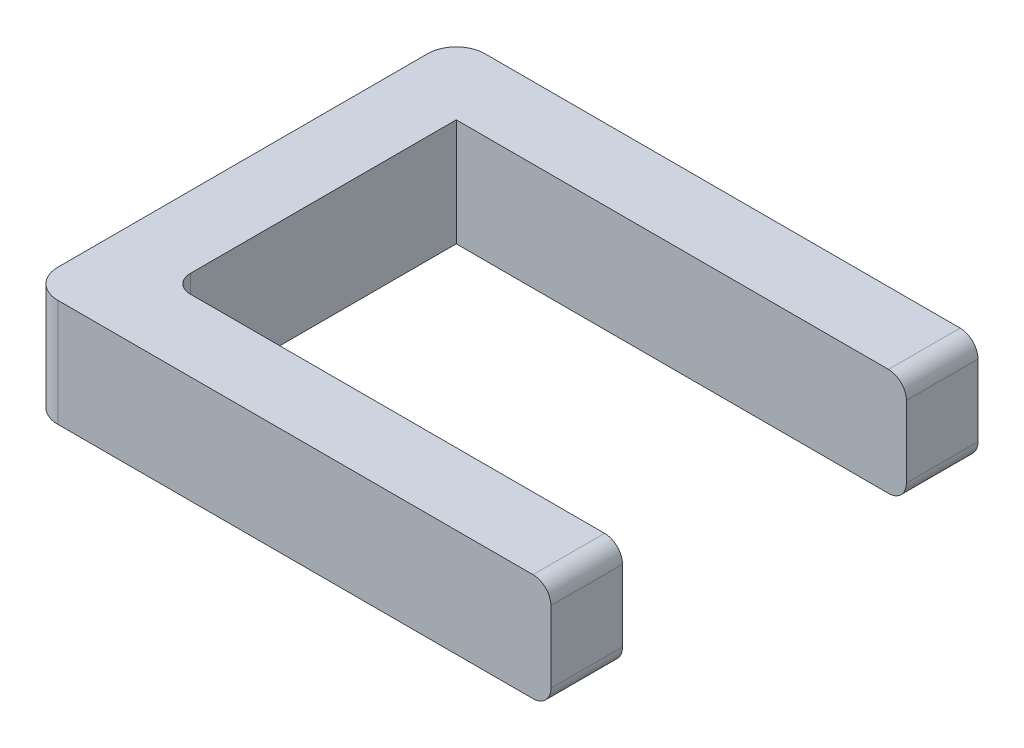
ISO-10303-21;
HEADER;
FILE_DESCRIPTION(('STEP AP214'),'2;1');
FILE_NAME('part.step','',(''),(''),'','','');
FILE_SCHEMA(('AUTOMOTIVE_DESIGN { 1 0 10303 214 1 1 1 1 }'));
ENDSEC;
DATA;
#1=APPLICATION_CONTEXT('core data for automotive mechanical design processes');
#2=APPLICATION_PROTOCOL_DEFINITION('international standard','automotive_design',2000,#1);
#3=PRODUCT_CONTEXT('',#1,'mechanical');
#4=PRODUCT('Part','Part','',(#3));
#5=PRODUCT_RELATED_PRODUCT_CATEGORY('part','',(#4));
#6=PRODUCT_DEFINITION_FORMATION('','',#4);
#7=PRODUCT_DEFINITION_CONTEXT('part definition',#1,'design');
#8=PRODUCT_DEFINITION('design','',#6,#7);
#9=PRODUCT_DEFINITION_SHAPE('','',#8);
#10=(LENGTH_UNIT() NAMED_UNIT(*) SI_UNIT(.MILLI.,.METRE.));
#11=(NAMED_UNIT(*) PLANE_ANGLE_UNIT() SI_UNIT($,.RADIAN.));
#12=(NAMED_UNIT(*) SI_UNIT($,.STERADIAN.) SOLID_ANGLE_UNIT());
#13=UNCERTAINTY_MEASURE_WITH_UNIT(LENGTH_MEASURE(1.E-05),#10,'distance_accuracy_value','');
#14=(GEOMETRIC_REPRESENTATION_CONTEXT(3) GLOBAL_UNCERTAINTY_ASSIGNED_CONTEXT((#13)) GLOBAL_UNIT_ASSIGNED_CONTEXT((#10,
#11,#12)) REPRESENTATION_CONTEXT('',''));
#15=CARTESIAN_POINT('',(0.,0.,0.));
#16=DIRECTION('',(0.,0.,1.));
#17=DIRECTION('',(1.,0.,0.));
#18=AXIS2_PLACEMENT_3D('',#15,#16,#17);
#19=CARTESIAN_POINT('',(0.,-38.1,0.));
#20=DIRECTION('',(1.,0.,0.));
#21=DIRECTION('',(0.,0.,-1.));
#22=AXIS2_PLACEMENT_3D('',#19,#20,#21);
#23=PLANE('',#22);
#24=DIRECTION('',(0.,0.,-1.));
#25=VECTOR('',#24,1.);
#26=CARTESIAN_POINT('',(0.,0.,0.));
#27=LINE('',#26,#25);
#28=CARTESIAN_POINT('',(0.,0.,-6.35));
#29=VERTEX_POINT('',#28);
#30=CARTESIAN_POINT('',(0.,0.,-100.71236973121));
#31=VERTEX_POINT('',#30);
#32=EDGE_CURVE('E179',#29,#31,#27,.T.);
#33=ORIENTED_EDGE('',*,*,#32,.F.);
#34=DIRECTION('',(0.,1.,0.));
#35=VECTOR('',#34,1.);
#36=CARTESIAN_POINT('',(0.,-38.1,-6.35));
#37=LINE('',#36,#35);
#38=CARTESIAN_POINT('',(0.,-38.1,-6.35));
#39=VERTEX_POINT('',#38);
#40=EDGE_CURVE('E157',#29,#39,#37,.F.);
#41=ORIENTED_EDGE('',*,*,#40,.T.);
#42=DIRECTION('',(0.,0.,-1.));
#43=VECTOR('',#42,1.);
#44=CARTESIAN_POINT('',(0.,-38.1,0.));
#45=LINE('',#44,#43);
#46=CARTESIAN_POINT('',(0.,-38.1,-100.71236973121));
#47=VERTEX_POINT('',#46);
#48=EDGE_CURVE('E143',#39,#47,#45,.T.);
#49=ORIENTED_EDGE('',*,*,#48,.T.);
#50=DIRECTION('',(0.,1.,0.));
#51=VECTOR('',#50,1.);
#52=CARTESIAN_POINT('',(0.,-38.1,-100.71236973121));
#53=LINE('',#52,#51);
#54=EDGE_CURVE('E155',#47,#31,#53,.T.);
#55=ORIENTED_EDGE('',*,*,#54,.T.);
#56=EDGE_LOOP('',(#33,#41,#49,#55));
#57=FACE_BOUND('',#56,.T.);
#58=ADVANCED_FACE('F30',(#57),#23,.T.);
#59=CARTESIAN_POINT('',(0.,-38.1,0.));
#60=DIRECTION('',(0.,0.,-1.));
#61=DIRECTION('',(-1.,0.,0.));
#62=AXIS2_PLACEMENT_3D('',#59,#60,#61);
#63=PLANE('',#62);
#64=DIRECTION('',(-1.,0.,0.));
#65=VECTOR('',#64,1.);
#66=CARTESIAN_POINT('',(0.,-38.1,0.));
#67=LINE('',#66,#65);
#68=CARTESIAN_POINT('',(153.326223170051,-38.1,0.));
#69=VERTEX_POINT('',#68);
#70=CARTESIAN_POINT('',(6.35,-38.1,0.));
#71=VERTEX_POINT('',#70);
#72=EDGE_CURVE('E175',#69,#71,#67,.T.);
#73=ORIENTED_EDGE('',*,*,#72,.T.);
#74=DIRECTION('',(0.,1.,0.));
#75=VECTOR('',#74,1.);
#76=CARTESIAN_POINT('',(6.35,0.,0.));
#77=LINE('',#76,#75);
#78=CARTESIAN_POINT('',(6.35,0.,0.));
#79=VERTEX_POINT('',#78);
#80=EDGE_CURVE('E196',#71,#79,#77,.T.);
#81=ORIENTED_EDGE('',*,*,#80,.T.);
#82=DIRECTION('',(-1.,0.,0.));
#83=VECTOR('',#82,1.);
#84=CARTESIAN_POINT('',(0.,0.,0.));
#85=LINE('',#84,#83);
#86=CARTESIAN_POINT('',(153.326223170051,0.,0.));
#87=VERTEX_POINT('',#86);
#88=EDGE_CURVE('E159',#87,#79,#85,.T.);
#89=ORIENTED_EDGE('',*,*,#88,.F.);
#90=CARTESIAN_POINT('',(153.326223170051,-6.35,0.));
#91=DIRECTION('',(0.,0.,-1.));
#92=DIRECTION('',(-1.,0.,0.));
#93=AXIS2_PLACEMENT_3D('',#90,#91,#92);
#94=CIRCLE('',#93,6.35);
#95=CARTESIAN_POINT('',(159.676223170051,-6.35000000000002,0.));
#96=VERTEX_POINT('',#95);
#97=EDGE_CURVE('E190',#87,#96,#94,.T.);
#98=ORIENTED_EDGE('',*,*,#97,.T.);
#99=DIRECTION('',(0.,1.,0.));
#100=VECTOR('',#99,1.);
#101=CARTESIAN_POINT('',(159.676223170051,-38.1,0.));
#102=LINE('',#101,#100);
#103=CARTESIAN_POINT('',(159.676223170051,-31.75,0.));
#104=VERTEX_POINT('',#103);
#105=EDGE_CURVE('E187',#104,#96,#102,.T.);
#106=ORIENTED_EDGE('',*,*,#105,.F.);
#107=CARTESIAN_POINT('',(153.326223170051,-31.75,0.));
#108=DIRECTION('',(0.,0.,-1.));
#109=DIRECTION('',(-1.,0.,0.));
#110=AXIS2_PLACEMENT_3D('',#107,#108,#109);
#111=CIRCLE('',#110,6.35);
#112=EDGE_CURVE('E194',#104,#69,#111,.T.);
#113=ORIENTED_EDGE('',*,*,#112,.T.);
#114=EDGE_LOOP('',(#73,#81,#89,#98,#106,#113));
#115=FACE_BOUND('',#114,.T.);
#116=ADVANCED_FACE('F283',(#115),#63,.T.);
#117=CARTESIAN_POINT('',(159.676223170051,-38.1,0.));
#118=DIRECTION('',(1.,0.,0.));
#119=DIRECTION('',(0.,0.,-1.));
#120=AXIS2_PLACEMENT_3D('',#117,#118,#119);
#121=PLANE('',#120);
#122=DIRECTION('',(0.,1.,0.));
#123=VECTOR('',#122,1.);
#124=CARTESIAN_POINT('',(159.676223170051,-38.1,25.4));
#125=LINE('',#124,#123);
#126=CARTESIAN_POINT('',(159.676223170051,-31.75,25.4));
#127=VERTEX_POINT('',#126);
#128=CARTESIAN_POINT('',(159.676223170051,-6.35000000000002,25.4));
#129=VERTEX_POINT('',#128);
#130=EDGE_CURVE('E178',#127,#129,#125,.T.);
#131=ORIENTED_EDGE('',*,*,#130,.F.);
#132=DIRECTION('',(0.,0.,-1.));
#133=VECTOR('',#132,1.);
#134=CARTESIAN_POINT('',(159.676223170051,-31.75,0.));
#135=LINE('',#134,#133);
#136=EDGE_CURVE('E202',#127,#104,#135,.T.);
#137=ORIENTED_EDGE('',*,*,#136,.T.);
#138=ORIENTED_EDGE('',*,*,#105,.T.);
#139=DIRECTION('',(0.,0.,-1.));
#140=VECTOR('',#139,1.);
#141=CARTESIAN_POINT('',(159.676223170051,-6.35,25.4));
#142=LINE('',#141,#140);
#143=EDGE_CURVE('E200',#96,#129,#142,.F.);
#144=ORIENTED_EDGE('',*,*,#143,.T.);
#145=EDGE_LOOP('',(#131,#137,#138,#144));
#146=FACE_BOUND('',#145,.T.);
#147=ADVANCED_FACE('F288',(#146),#121,.T.);
#148=CARTESIAN_POINT('',(-25.4,-38.1,25.4));
#149=DIRECTION('',(0.,0.,1.));
#150=DIRECTION('',(1.,0.,0.));
#151=AXIS2_PLACEMENT_3D('',#148,#149,#150);
#152=PLANE('',#151);
#153=DIRECTION('',(1.,0.,0.));
#154=VECTOR('',#153,1.);
#155=CARTESIAN_POINT('',(-25.4,0.,25.4));
#156=LINE('',#155,#154);
#157=CARTESIAN_POINT('',(-15.24,0.,25.4));
#158=VERTEX_POINT('',#157);
#159=CARTESIAN_POINT('',(153.326223170051,0.,25.4));
#160=VERTEX_POINT('',#159);
#161=EDGE_CURVE('E183',#158,#160,#156,.T.);
#162=ORIENTED_EDGE('',*,*,#161,.F.);
#163=DIRECTION('',(0.,1.,0.));
#164=VECTOR('',#163,1.);
#165=CARTESIAN_POINT('',(-15.24,-38.1,25.4));
#166=LINE('',#165,#164);
#167=CARTESIAN_POINT('',(-15.24,-38.1,25.4));
#168=VERTEX_POINT('',#167);
#169=EDGE_CURVE('E225',#158,#168,#166,.F.);
#170=ORIENTED_EDGE('',*,*,#169,.T.);
#171=DIRECTION('',(1.,0.,0.));
#172=VECTOR('',#171,1.);
#173=CARTESIAN_POINT('',(-25.4,-38.1,25.4));
#174=LINE('',#173,#172);
#175=CARTESIAN_POINT('',(153.326223170051,-38.1,25.4));
#176=VERTEX_POINT('',#175);
#177=EDGE_CURVE('E173',#168,#176,#174,.T.);
#178=ORIENTED_EDGE('',*,*,#177,.T.);
#179=CARTESIAN_POINT('',(153.326223170051,-31.75,25.4));
#180=DIRECTION('',(0.,0.,1.));
#181=DIRECTION('',(1.,0.,0.));
#182=AXIS2_PLACEMENT_3D('',#179,#180,#181);
#183=CIRCLE('',#182,6.35);
#184=EDGE_CURVE('E211',#176,#127,#183,.T.);
#185=ORIENTED_EDGE('',*,*,#184,.T.);
#186=ORIENTED_EDGE('',*,*,#130,.T.);
#187=CARTESIAN_POINT('',(153.326223170051,-6.35,25.4));
#188=DIRECTION('',(0.,0.,1.));
#189=DIRECTION('',(1.,0.,0.));
#190=AXIS2_PLACEMENT_3D('',#187,#188,#189);
#191=CIRCLE('',#190,6.35);
#192=EDGE_CURVE('E208',#129,#160,#191,.T.);
#193=ORIENTED_EDGE('',*,*,#192,.T.);
#194=EDGE_LOOP('',(#162,#170,#178,#185,#186,#193));
#195=FACE_BOUND('',#194,.T.);
#196=ADVANCED_FACE('F320',(#195),#152,.T.);
#197=CARTESIAN_POINT('',(-25.4,-38.1,25.4));
#198=DIRECTION('',(-1.,0.,0.));
#199=DIRECTION('',(0.,0.,1.));
#200=AXIS2_PLACEMENT_3D('',#197,#198,#199);
#201=PLANE('',#200);
#202=DIRECTION('',(0.,0.,1.));
#203=VECTOR('',#202,1.);
#204=CARTESIAN_POINT('',(-25.4,0.,25.4));
#205=LINE('',#204,#203);
#206=CARTESIAN_POINT('',(-25.4,0.,-115.95236973121));
#207=VERTEX_POINT('',#206);
#208=CARTESIAN_POINT('',(-25.4,0.,15.24));
#209=VERTEX_POINT('',#208);
#210=EDGE_CURVE('E181',#207,#209,#205,.T.);
#211=ORIENTED_EDGE('',*,*,#210,.F.);
#212=DIRECTION('',(0.,1.,0.));
#213=VECTOR('',#212,1.);
#214=CARTESIAN_POINT('',(-25.4,-38.1,-115.95236973121));
#215=LINE('',#214,#213);
#216=CARTESIAN_POINT('',(-25.4,-38.1,-115.95236973121));
#217=VERTEX_POINT('',#216);
#218=EDGE_CURVE('E235',#207,#217,#215,.F.);
#219=ORIENTED_EDGE('',*,*,#218,.T.);
#220=DIRECTION('',(0.,0.,1.));
#221=VECTOR('',#220,1.);
#222=CARTESIAN_POINT('',(-25.4,-38.1,25.4));
#223=LINE('',#222,#221);
#224=CARTESIAN_POINT('',(-25.4,-38.1,15.24));
#225=VERTEX_POINT('',#224);
#226=EDGE_CURVE('E158',#217,#225,#223,.T.);
#227=ORIENTED_EDGE('',*,*,#226,.T.);
#228=DIRECTION('',(0.,1.,0.));
#229=VECTOR('',#228,1.);
#230=CARTESIAN_POINT('',(-25.4,-38.1,15.24));
#231=LINE('',#230,#229);
#232=EDGE_CURVE('E220',#225,#209,#231,.T.);
#233=ORIENTED_EDGE('',*,*,#232,.T.);
#234=EDGE_LOOP('',(#211,#219,#227,#233));
#235=FACE_BOUND('',#234,.T.);
#236=ADVANCED_FACE('F271',(#235),#201,.T.);
#237=CARTESIAN_POINT('',(0.,-38.1,-50.3561848656052));
#238=DIRECTION('',(0.,-1.,0.));
#239=DIRECTION('',(0.,0.,-1.));
#240=AXIS2_PLACEMENT_3D('',#237,#238,#239);
#241=PLANE('',#240);
#242=DIRECTION('',(1.,0.,0.));
#243=VECTOR('',#242,1.);
#244=CARTESIAN_POINT('',(-25.4,-38.1,-126.11236973121));
#245=LINE('',#244,#243);
#246=CARTESIAN_POINT('',(-15.24,-38.1,-126.11236973121));
#247=VERTEX_POINT('',#246);
#248=CARTESIAN_POINT('',(153.326223170051,-38.1,-126.11236973121));
#249=VERTEX_POINT('',#248);
#250=EDGE_CURVE('E149',#247,#249,#245,.T.);
#251=ORIENTED_EDGE('',*,*,#250,.T.);
#252=DIRECTION('',(0.,0.,1.));
#253=VECTOR('',#252,1.);
#254=CARTESIAN_POINT('',(153.326223170051,-38.1,-100.71236973121));
#255=LINE('',#254,#253);
#256=CARTESIAN_POINT('',(153.326223170051,-38.1,-100.71236973121));
#257=VERTEX_POINT('',#256);
#258=EDGE_CURVE('E146',#249,#257,#255,.T.);
#259=ORIENTED_EDGE('',*,*,#258,.T.);
#260=DIRECTION('',(-1.,0.,0.));
#261=VECTOR('',#260,1.);
#262=CARTESIAN_POINT('',(0.,-38.1,-100.71236973121));
#263=LINE('',#262,#261);
#264=EDGE_CURVE('E139',#257,#47,#263,.T.);
#265=ORIENTED_EDGE('',*,*,#264,.T.);
#266=ORIENTED_EDGE('',*,*,#48,.F.);
#267=CARTESIAN_POINT('',(6.35,-38.1,-6.35));
#268=DIRECTION('',(0.,-1.,0.));
#269=DIRECTION('',(0.,0.,-1.));
#270=AXIS2_PLACEMENT_3D('',#267,#268,#269);
#271=CIRCLE('',#270,6.35);
#272=EDGE_CURVE('E218',#39,#71,#271,.F.);
#273=ORIENTED_EDGE('',*,*,#272,.T.);
#274=ORIENTED_EDGE('',*,*,#72,.F.);
#275=DIRECTION('',(0.,0.,-1.));
#276=VECTOR('',#275,1.);
#277=CARTESIAN_POINT('',(153.326223170051,-38.1,-50.3561848656052));
#278=LINE('',#277,#276);
#279=EDGE_CURVE('E205',#69,#176,#278,.F.);
#280=ORIENTED_EDGE('',*,*,#279,.T.);
#281=ORIENTED_EDGE('',*,*,#177,.F.);
#282=CARTESIAN_POINT('',(-15.24,-38.1,15.24));
#283=DIRECTION('',(0.,-1.,0.));
#284=DIRECTION('',(0.,0.,-1.));
#285=AXIS2_PLACEMENT_3D('',#282,#283,#284);
#286=CIRCLE('',#285,10.16);
#287=EDGE_CURVE('E227',#168,#225,#286,.T.);
#288=ORIENTED_EDGE('',*,*,#287,.T.);
#289=ORIENTED_EDGE('',*,*,#226,.F.);
#290=CARTESIAN_POINT('',(-15.24,-38.1,-115.95236973121));
#291=DIRECTION('',(0.,-1.,0.));
#292=DIRECTION('',(0.,0.,-1.));
#293=AXIS2_PLACEMENT_3D('',#290,#291,#292);
#294=CIRCLE('',#293,10.16);
#295=EDGE_CURVE('E237',#217,#247,#294,.T.);
#296=ORIENTED_EDGE('',*,*,#295,.T.);
#297=EDGE_LOOP('',(#251,#259,#265,#266,#273,#274,#280,#281,#288,#289,#296));
#298=FACE_BOUND('',#297,.T.);
#299=ADVANCED_FACE('F142',(#298),#241,.T.);
#300=CARTESIAN_POINT('',(0.,0.,-50.3561848656052));
#301=DIRECTION('',(0.,-1.,0.));
#302=DIRECTION('',(0.,0.,-1.));
#303=AXIS2_PLACEMENT_3D('',#300,#301,#302);
#304=PLANE('',#303);
#305=DIRECTION('',(-1.,0.,0.));
#306=VECTOR('',#305,1.);
#307=CARTESIAN_POINT('',(0.,0.,-100.71236973121));
#308=LINE('',#307,#306);
#309=CARTESIAN_POINT('',(153.326223170051,0.,-100.71236973121));
#310=VERTEX_POINT('',#309);
#311=EDGE_CURVE('E162',#310,#31,#308,.T.);
#312=ORIENTED_EDGE('',*,*,#311,.F.);
#313=DIRECTION('',(0.,0.,1.));
#314=VECTOR('',#313,1.);
#315=CARTESIAN_POINT('',(153.326223170051,0.,-50.3561848656052));
#316=LINE('',#315,#314);
#317=CARTESIAN_POINT('',(153.326223170051,0.,-126.11236973121));
#318=VERTEX_POINT('',#317);
#319=EDGE_CURVE('E11',#310,#318,#316,.F.);
#320=ORIENTED_EDGE('',*,*,#319,.T.);
#321=DIRECTION('',(1.,0.,0.));
#322=VECTOR('',#321,1.);
#323=CARTESIAN_POINT('',(-25.4,0.,-126.11236973121));
#324=LINE('',#323,#322);
#325=CARTESIAN_POINT('',(-15.24,0.,-126.11236973121));
#326=VERTEX_POINT('',#325);
#327=EDGE_CURVE('E150',#326,#318,#324,.T.);
#328=ORIENTED_EDGE('',*,*,#327,.F.);
#329=CARTESIAN_POINT('',(-15.24,0.,-115.95236973121));
#330=DIRECTION('',(0.,-1.,0.));
#331=DIRECTION('',(0.,0.,-1.));
#332=AXIS2_PLACEMENT_3D('',#329,#330,#331);
#333=CIRCLE('',#332,10.16);
#334=EDGE_CURVE('E233',#326,#207,#333,.F.);
#335=ORIENTED_EDGE('',*,*,#334,.T.);
#336=ORIENTED_EDGE('',*,*,#210,.T.);
#337=CARTESIAN_POINT('',(-15.24,0.,15.24));
#338=DIRECTION('',(0.,-1.,0.));
#339=DIRECTION('',(0.,0.,-1.));
#340=AXIS2_PLACEMENT_3D('',#337,#338,#339);
#341=CIRCLE('',#340,10.16);
#342=EDGE_CURVE('E223',#209,#158,#341,.F.);
#343=ORIENTED_EDGE('',*,*,#342,.T.);
#344=ORIENTED_EDGE('',*,*,#161,.T.);
#345=DIRECTION('',(0.,0.,-1.));
#346=VECTOR('',#345,1.);
#347=CARTESIAN_POINT('',(153.326223170051,0.,0.));
#348=LINE('',#347,#346);
#349=EDGE_CURVE('E213',#160,#87,#348,.T.);
#350=ORIENTED_EDGE('',*,*,#349,.T.);
#351=ORIENTED_EDGE('',*,*,#88,.T.);
#352=CARTESIAN_POINT('',(6.35,0.,-6.35));
#353=DIRECTION('',(0.,-1.,0.));
#354=DIRECTION('',(0.,0.,-1.));
#355=AXIS2_PLACEMENT_3D('',#352,#353,#354);
#356=CIRCLE('',#355,6.35);
#357=EDGE_CURVE('E216',#79,#29,#356,.T.);
#358=ORIENTED_EDGE('',*,*,#357,.T.);
#359=ORIENTED_EDGE('',*,*,#32,.T.);
#360=EDGE_LOOP('',(#312,#320,#328,#335,#336,#343,#344,#350,#351,#358,#359));
#361=FACE_BOUND('',#360,.T.);
#362=ADVANCED_FACE('F263',(#361),#304,.F.);
#363=CARTESIAN_POINT('',(6.35,-38.1,-6.35));
#364=DIRECTION('',(0.,-1.,0.));
#365=DIRECTION('',(0.,0.,-1.));
#366=AXIS2_PLACEMENT_3D('',#363,#364,#365);
#367=CYLINDRICAL_SURFACE('',#366,6.35);
#368=ORIENTED_EDGE('',*,*,#272,.F.);
#369=ORIENTED_EDGE('',*,*,#40,.F.);
#370=ORIENTED_EDGE('',*,*,#357,.F.);
#371=ORIENTED_EDGE('',*,*,#80,.F.);
#372=EDGE_LOOP('',(#368,#369,#370,#371));
#373=FACE_BOUND('',#372,.T.);
#374=ADVANCED_FACE('F294',(#373),#367,.F.);
#375=CARTESIAN_POINT('',(153.326223170051,-31.75,0.));
#376=DIRECTION('',(0.,0.,-1.));
#377=DIRECTION('',(-1.,0.,0.));
#378=AXIS2_PLACEMENT_3D('',#375,#376,#377);
#379=CYLINDRICAL_SURFACE('',#378,6.35);
#380=ORIENTED_EDGE('',*,*,#184,.F.);
#381=ORIENTED_EDGE('',*,*,#279,.F.);
#382=ORIENTED_EDGE('',*,*,#112,.F.);
#383=ORIENTED_EDGE('',*,*,#136,.F.);
#384=EDGE_LOOP('',(#380,#381,#382,#383));
#385=FACE_BOUND('',#384,.T.);
#386=ADVANCED_FACE('F297',(#385),#379,.T.);
#387=CARTESIAN_POINT('',(153.326223170051,-6.35,-50.3561848656052));
#388=DIRECTION('',(0.,0.,1.));
#389=DIRECTION('',(1.,0.,0.));
#390=AXIS2_PLACEMENT_3D('',#387,#388,#389);
#391=CYLINDRICAL_SURFACE('',#390,6.35);
#392=ORIENTED_EDGE('',*,*,#192,.F.);
#393=ORIENTED_EDGE('',*,*,#143,.F.);
#394=ORIENTED_EDGE('',*,*,#97,.F.);
#395=ORIENTED_EDGE('',*,*,#349,.F.);
#396=EDGE_LOOP('',(#392,#393,#394,#395));
#397=FACE_BOUND('',#396,.T.);
#398=ADVANCED_FACE('F301',(#397),#391,.T.);
#399=CARTESIAN_POINT('',(-15.24,-38.1,15.24));
#400=DIRECTION('',(0.,1.,0.));
#401=DIRECTION('',(0.,0.,1.));
#402=AXIS2_PLACEMENT_3D('',#399,#400,#401);
#403=CYLINDRICAL_SURFACE('',#402,10.16);
#404=ORIENTED_EDGE('',*,*,#287,.F.);
#405=ORIENTED_EDGE('',*,*,#169,.F.);
#406=ORIENTED_EDGE('',*,*,#342,.F.);
#407=ORIENTED_EDGE('',*,*,#232,.F.);
#408=EDGE_LOOP('',(#404,#405,#406,#407));
#409=FACE_BOUND('',#408,.T.);
#410=ADVANCED_FACE('F304',(#409),#403,.T.);
#411=CARTESIAN_POINT('',(-25.4,-38.1,-126.11236973121));
#412=DIRECTION('',(0.,0.,1.));
#413=DIRECTION('',(1.,0.,0.));
#414=AXIS2_PLACEMENT_3D('',#411,#412,#413);
#415=PLANE('',#414);
#416=DIRECTION('',(0.,1.,0.));
#417=VECTOR('',#416,1.);
#418=CARTESIAN_POINT('',(159.676223170051,-38.1,-126.11236973121));
#419=LINE('',#418,#417);
#420=CARTESIAN_POINT('',(159.676223170051,-31.75,-126.11236973121));
#421=VERTEX_POINT('',#420);
#422=CARTESIAN_POINT('',(159.676223170051,-6.35000000000002,-126.11236973121));
#423=VERTEX_POINT('',#422);
#424=EDGE_CURVE('E167',#421,#423,#419,.T.);
#425=ORIENTED_EDGE('',*,*,#424,.F.);
#426=CARTESIAN_POINT('',(153.326223170051,-31.75,-126.11236973121));
#427=DIRECTION('',(0.,0.,1.));
#428=DIRECTION('',(1.,0.,0.));
#429=AXIS2_PLACEMENT_3D('',#426,#427,#428);
#430=CIRCLE('',#429,6.35);
#431=EDGE_CURVE('E38',#421,#249,#430,.F.);
#432=ORIENTED_EDGE('',*,*,#431,.T.);
#433=ORIENTED_EDGE('',*,*,#250,.F.);
#434=DIRECTION('',(0.,1.,0.));
#435=VECTOR('',#434,1.);
#436=CARTESIAN_POINT('',(-15.24,0.,-126.11236973121));
#437=LINE('',#436,#435);
#438=EDGE_CURVE('E230',#247,#326,#437,.T.);
#439=ORIENTED_EDGE('',*,*,#438,.T.);
#440=ORIENTED_EDGE('',*,*,#327,.T.);
#441=CARTESIAN_POINT('',(153.326223170051,-6.35,-126.11236973121));
#442=DIRECTION('',(0.,0.,1.));
#443=DIRECTION('',(1.,0.,0.));
#444=AXIS2_PLACEMENT_3D('',#441,#442,#443);
#445=CIRCLE('',#444,6.35);
#446=EDGE_CURVE('E50',#318,#423,#445,.F.);
#447=ORIENTED_EDGE('',*,*,#446,.T.);
#448=EDGE_LOOP('',(#425,#432,#433,#439,#440,#447));
#449=FACE_BOUND('',#448,.T.);
#450=ADVANCED_FACE('F251',(#449),#415,.F.);
#451=CARTESIAN_POINT('',(159.676223170051,-38.1,-100.71236973121));
#452=DIRECTION('',(-1.,0.,0.));
#453=DIRECTION('',(0.,0.,1.));
#454=AXIS2_PLACEMENT_3D('',#451,#452,#453);
#455=PLANE('',#454);
#456=DIRECTION('',(0.,1.,0.));
#457=VECTOR('',#456,1.);
#458=CARTESIAN_POINT('',(159.676223170051,-38.1,-100.71236973121));
#459=LINE('',#458,#457);
#460=CARTESIAN_POINT('',(159.676223170051,-31.75,-100.71236973121));
#461=VERTEX_POINT('',#460);
#462=CARTESIAN_POINT('',(159.676223170051,-6.35000000000002,-100.71236973121));
#463=VERTEX_POINT('',#462);
#464=EDGE_CURVE('E164',#461,#463,#459,.T.);
#465=ORIENTED_EDGE('',*,*,#464,.F.);
#466=DIRECTION('',(0.,0.,1.));
#467=VECTOR('',#466,1.);
#468=CARTESIAN_POINT('',(159.676223170051,-31.75,-126.11236973121));
#469=LINE('',#468,#467);
#470=EDGE_CURVE('E247',#461,#421,#469,.F.);
#471=ORIENTED_EDGE('',*,*,#470,.T.);
#472=ORIENTED_EDGE('',*,*,#424,.T.);
#473=DIRECTION('',(0.,0.,1.));
#474=VECTOR('',#473,1.);
#475=CARTESIAN_POINT('',(159.676223170051,-6.35,-100.71236973121));
#476=LINE('',#475,#474);
#477=EDGE_CURVE('E244',#423,#463,#476,.T.);
#478=ORIENTED_EDGE('',*,*,#477,.T.);
#479=EDGE_LOOP('',(#465,#471,#472,#478));
#480=FACE_BOUND('',#479,.T.);
#481=ADVANCED_FACE('F260',(#480),#455,.F.);
#482=CARTESIAN_POINT('',(0.,-38.1,-100.71236973121));
#483=DIRECTION('',(0.,0.,-1.));
#484=DIRECTION('',(-1.,0.,0.));
#485=AXIS2_PLACEMENT_3D('',#482,#483,#484);
#486=PLANE('',#485);
#487=ORIENTED_EDGE('',*,*,#264,.F.);
#488=CARTESIAN_POINT('',(153.326223170051,-31.75,-100.71236973121));
#489=DIRECTION('',(0.,0.,-1.));
#490=DIRECTION('',(-1.,0.,0.));
#491=AXIS2_PLACEMENT_3D('',#488,#489,#490);
#492=CIRCLE('',#491,6.35);
#493=EDGE_CURVE('E242',#257,#461,#492,.F.);
#494=ORIENTED_EDGE('',*,*,#493,.T.);
#495=ORIENTED_EDGE('',*,*,#464,.T.);
#496=CARTESIAN_POINT('',(153.326223170051,-6.35,-100.71236973121));
#497=DIRECTION('',(0.,0.,-1.));
#498=DIRECTION('',(-1.,0.,0.));
#499=AXIS2_PLACEMENT_3D('',#496,#497,#498);
#500=CIRCLE('',#499,6.35);
#501=EDGE_CURVE('E240',#463,#310,#500,.F.);
#502=ORIENTED_EDGE('',*,*,#501,.T.);
#503=ORIENTED_EDGE('',*,*,#311,.T.);
#504=ORIENTED_EDGE('',*,*,#54,.F.);
#505=EDGE_LOOP('',(#487,#494,#495,#502,#503,#504));
#506=FACE_BOUND('',#505,.T.);
#507=ADVANCED_FACE('F161',(#506),#486,.F.);
#508=CARTESIAN_POINT('',(-15.24,-38.1,-115.95236973121));
#509=DIRECTION('',(0.,-1.,0.));
#510=DIRECTION('',(0.,0.,-1.));
#511=AXIS2_PLACEMENT_3D('',#508,#509,#510);
#512=CYLINDRICAL_SURFACE('',#511,10.16);
#513=ORIENTED_EDGE('',*,*,#295,.F.);
#514=ORIENTED_EDGE('',*,*,#218,.F.);
#515=ORIENTED_EDGE('',*,*,#334,.F.);
#516=ORIENTED_EDGE('',*,*,#438,.F.);
#517=EDGE_LOOP('',(#513,#514,#515,#516));
#518=FACE_BOUND('',#517,.T.);
#519=ADVANCED_FACE('F273',(#518),#512,.T.);
#520=CARTESIAN_POINT('',(153.326223170051,-31.75,-50.3561848656052));
#521=DIRECTION('',(0.,0.,-1.));
#522=DIRECTION('',(-1.,0.,0.));
#523=AXIS2_PLACEMENT_3D('',#520,#521,#522);
#524=CYLINDRICAL_SURFACE('',#523,6.35);
#525=ORIENTED_EDGE('',*,*,#431,.F.);
#526=ORIENTED_EDGE('',*,*,#470,.F.);
#527=ORIENTED_EDGE('',*,*,#493,.F.);
#528=ORIENTED_EDGE('',*,*,#258,.F.);
#529=EDGE_LOOP('',(#525,#526,#527,#528));
#530=FACE_BOUND('',#529,.T.);
#531=ADVANCED_FACE('F257',(#530),#524,.T.);
#532=CARTESIAN_POINT('',(153.326223170051,-6.35,-100.71236973121));
#533=DIRECTION('',(0.,0.,1.));
#534=DIRECTION('',(1.,0.,0.));
#535=AXIS2_PLACEMENT_3D('',#532,#533,#534);
#536=CYLINDRICAL_SURFACE('',#535,6.35);
#537=ORIENTED_EDGE('',*,*,#446,.F.);
#538=ORIENTED_EDGE('',*,*,#319,.F.);
#539=ORIENTED_EDGE('',*,*,#501,.F.);
#540=ORIENTED_EDGE('',*,*,#477,.F.);
#541=EDGE_LOOP('',(#537,#538,#539,#540));
#542=FACE_BOUND('',#541,.T.);
#543=ADVANCED_FACE('F32',(#542),#536,.T.);
#544=CLOSED_SHELL('',(#58,#116,#147,#196,#236,#299,#362,#374,#386,#398,#410,#450,#481,#507,#519,
#531,#543));
#545=MANIFOLD_SOLID_BREP('B2',#544);
#546=ADVANCED_BREP_SHAPE_REPRESENTATION('',(#18,#545),#14);
#547=SHAPE_DEFINITION_REPRESENTATION(#9,#546);
ENDSEC;
END-ISO-10303-21;
